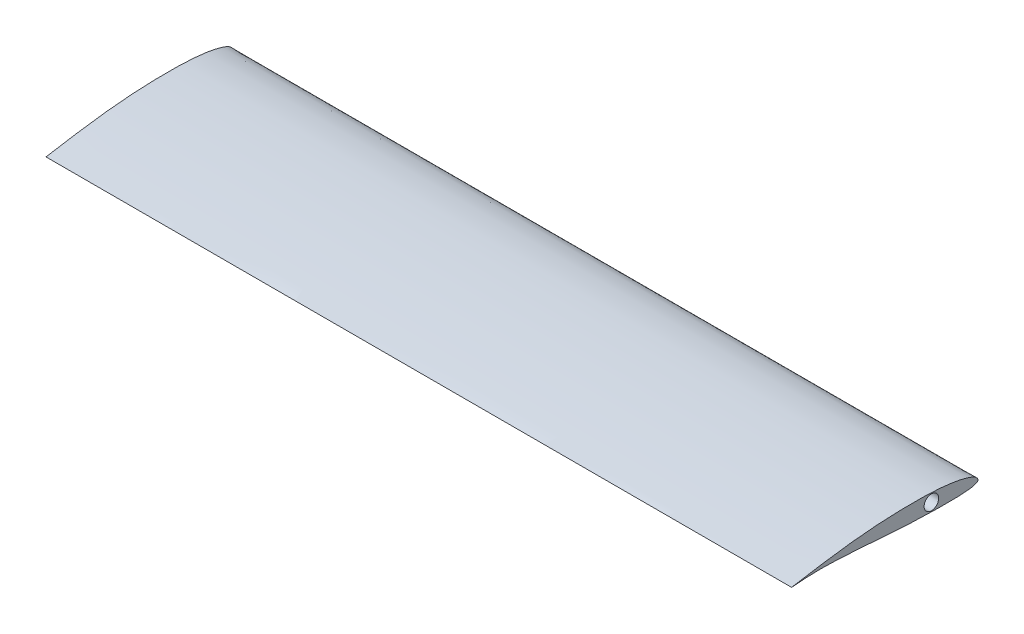
ISO-10303-21;
HEADER;
FILE_DESCRIPTION(('STEP AP214'),'2;1');
FILE_NAME('part.step','',(''),(''),'','','');
FILE_SCHEMA(('AUTOMOTIVE_DESIGN { 1 0 10303 214 1 1 1 1 }'));
ENDSEC;
DATA;
#1=APPLICATION_CONTEXT('core data for automotive mechanical design processes');
#2=APPLICATION_PROTOCOL_DEFINITION('international standard','automotive_design',2000,#1);
#3=PRODUCT_CONTEXT('',#1,'mechanical');
#4=PRODUCT('Part','Part','',(#3));
#5=PRODUCT_RELATED_PRODUCT_CATEGORY('part','',(#4));
#6=PRODUCT_DEFINITION_FORMATION('','',#4);
#7=PRODUCT_DEFINITION_CONTEXT('part definition',#1,'design');
#8=PRODUCT_DEFINITION('design','',#6,#7);
#9=PRODUCT_DEFINITION_SHAPE('','',#8);
#10=(LENGTH_UNIT() NAMED_UNIT(*) SI_UNIT(.MILLI.,.METRE.));
#11=(NAMED_UNIT(*) PLANE_ANGLE_UNIT() SI_UNIT($,.RADIAN.));
#12=(NAMED_UNIT(*) SI_UNIT($,.STERADIAN.) SOLID_ANGLE_UNIT());
#13=UNCERTAINTY_MEASURE_WITH_UNIT(LENGTH_MEASURE(1.E-05),#10,'distance_accuracy_value','');
#14=(GEOMETRIC_REPRESENTATION_CONTEXT(3) GLOBAL_UNCERTAINTY_ASSIGNED_CONTEXT((#13)) GLOBAL_UNIT_ASSIGNED_CONTEXT((#10,
#11,#12)) REPRESENTATION_CONTEXT('',''));
#15=CARTESIAN_POINT('',(0.,0.,0.));
#16=DIRECTION('',(0.,0.,1.));
#17=DIRECTION('',(1.,0.,0.));
#18=AXIS2_PLACEMENT_3D('',#15,#16,#17);
#19=CARTESIAN_POINT('',(920.,1.37734242151728,0.400284716731996));
#20=DIRECTION('',(-1.,0.,0.));
#21=DIRECTION('',(0.,0.,1.));
#22=AXIS2_PLACEMENT_3D('',#19,#20,#21);
#23=PLANE('',#22);
#24=CARTESIAN_POINT('',(920.,0.,230.));
#25=CARTESIAN_POINT('',(920.,-0.00739937229421117,230.000210030184));
#26=CARTESIAN_POINT('',(920.,0.158585605330025,228.422159074289));
#27=CARTESIAN_POINT('',(920.,0.28399481361177,226.796663425836));
#28=CARTESIAN_POINT('',(920.,0.63083810634416,222.814236355926));
#29=CARTESIAN_POINT('',(920.,0.988173406602738,217.861944362416));
#30=CARTESIAN_POINT('',(920.,1.37753186075403,211.305955075508));
#31=CARTESIAN_POINT('',(920.,1.67736111446265,203.489426002418));
#32=CARTESIAN_POINT('',(920.,1.8102160126262,194.430608751108));
#33=CARTESIAN_POINT('',(920.,1.68656337187299,184.34149344494));
#34=CARTESIAN_POINT('',(920.,1.27843686665431,173.419920532683));
#35=CARTESIAN_POINT('',(920.,0.649532951760826,161.877392424038));
#36=CARTESIAN_POINT('',(920.,-0.147391950236595,149.896910924253));
#37=CARTESIAN_POINT('',(920.,-1.05617502106426,137.646510004128));
#38=CARTESIAN_POINT('',(920.,-2.01565091705212,125.282246595146));
#39=CARTESIAN_POINT('',(920.,-2.96201726083683,112.945769304184));
#40=CARTESIAN_POINT('',(920.,-3.82052367657451,100.758449300459));
#41=CARTESIAN_POINT('',(920.,-4.54347921568493,88.8224082965802));
#42=CARTESIAN_POINT('',(920.,-5.09388424647181,77.2255537575113));
#43=CARTESIAN_POINT('',(920.,-5.4718363482422,66.0576921473994));
#44=CARTESIAN_POINT('',(920.,-5.72097486368047,55.4256355228258));
#45=CARTESIAN_POINT('',(920.,-5.84694017537255,45.4468342594944));
#46=CARTESIAN_POINT('',(920.,-5.87087692579245,36.2454480987242));
#47=CARTESIAN_POINT('',(920.,-5.76384529189728,27.9329800546095));
#48=CARTESIAN_POINT('',(920.,-5.53119172353439,20.6192066149059));
#49=CARTESIAN_POINT('',(920.,-5.14963918866787,14.3761290521995));
#50=CARTESIAN_POINT('',(920.,-4.53441005300758,9.26615491003243));
#51=CARTESIAN_POINT('',(920.,-3.71721122294693,5.24187720317273));
#52=CARTESIAN_POINT('',(920.,-2.63649274565435,2.41529498764514));
#53=CARTESIAN_POINT('',(920.,-1.57460619235819,0.455293487041985));
#54=CARTESIAN_POINT('',(920.,-0.377617892176388,-0.0196075451747678));
#55=CARTESIAN_POINT('',(920.,0.729247040567741,0.0286756636182197));
#56=CARTESIAN_POINT('',(920.,2.12122958997737,0.747591302541487));
#57=CARTESIAN_POINT('',(920.,3.89928423051589,2.5105544353957));
#58=CARTESIAN_POINT('',(920.,5.62871835138388,5.30831466195454));
#59=CARTESIAN_POINT('',(920.,7.28050666556761,9.09046737986192));
#60=CARTESIAN_POINT('',(920.,8.87001272411224,13.8689360302926));
#61=CARTESIAN_POINT('',(920.,10.3811847687813,19.5948520438879));
#62=CARTESIAN_POINT('',(920.,11.7653112178947,26.2173983506437));
#63=CARTESIAN_POINT('',(920.,12.9700081154773,33.6787835337481));
#64=CARTESIAN_POINT('',(920.,13.9466746957906,41.9271861650788));
#65=CARTESIAN_POINT('',(920.,14.6840316781373,50.9062772685125));
#66=CARTESIAN_POINT('',(920.,15.1745441593171,60.5512135785162));
#67=CARTESIAN_POINT('',(920.,15.4486305287309,70.7768661596188));
#68=CARTESIAN_POINT('',(920.,15.5155738004362,81.481593105865));
#69=CARTESIAN_POINT('',(920.,15.3885780681208,92.549239894699));
#70=CARTESIAN_POINT('',(920.,15.0727142586277,103.85771990383));
#71=CARTESIAN_POINT('',(920.,14.5595277732969,115.286686553618));
#72=CARTESIAN_POINT('',(920.,13.8481453204629,126.72428780931));
#73=CARTESIAN_POINT('',(920.,12.9345919482879,138.066593631518));
#74=CARTESIAN_POINT('',(920.,11.8510600271469,149.216065051228));
#75=CARTESIAN_POINT('',(920.,10.6253379183885,160.069948376467));
#76=CARTESIAN_POINT('',(920.,9.3069497507106,170.524175290706));
#77=CARTESIAN_POINT('',(920.,7.94178879521628,180.47003516189));
#78=CARTESIAN_POINT('',(920.,6.56099277314232,189.796406090078));
#79=CARTESIAN_POINT('',(920.,5.27272402660649,198.315522540053));
#80=CARTESIAN_POINT('',(920.,3.94983151698944,206.058984479174));
#81=CARTESIAN_POINT('',(920.,2.92726416383096,212.854340269484));
#82=CARTESIAN_POINT('',(920.,1.93102702391498,218.726725631985));
#83=CARTESIAN_POINT('',(920.,1.14619296332748,223.212303816592));
#84=CARTESIAN_POINT('',(920.,0.508635750532315,226.912966985873));
#85=CARTESIAN_POINT('',(920.,0.226519423468825,228.462126565138));
#86=CARTESIAN_POINT('',(920.,0.00733918706488364,229.999791678165));
#87=CARTESIAN_POINT('',(920.,0.,230.));
#88=B_SPLINE_CURVE_WITH_KNOTS('',3,(#24,#25,#26,#27,#28,#29,#30,#31,#32,#33,#34,#35,#36,#37,#38,
#39,#40,#41,#42,#43,#44,#45,#46,#47,#48,#49,#50,#51,#52,#53,#54,#55,#56,#57,#58,#59,#60,#61,#62,
#63,#64,#65,#66,#67,#68,#69,#70,#71,#72,#73,#74,#75,#76,#77,#78,#79,#80,#81,#82,#83,#84,#85,#86,
#87),.UNSPECIFIED.,.T.,.F.,(4,1,1,1,1,1,1,1,1,1,1,1,1,1,1,1,1,1,1,1,1,1,1,1,1,1,1,1,1,1,1,1,1,1,
1,1,1,1,1,1,1,1,1,1,1,1,1,1,1,1,1,1,1,1,1,1,1,1,1,1,1,4),(0.,0.00158888881614505,
0.0063292178355564,0.0142024564897436,0.0251728077530559,0.0391734833267743,0.0560606311759249,
0.0755789238487883,0.0973636066296903,0.120926258366677,0.145825281006277,0.171670911815127,
0.198108536705041,0.22479018357162,0.25139057978404,0.277643490654311,0.303326750051388,
0.328257458029316,0.352272548115194,0.375156061746876,0.396620664402003,0.416422729294005,
0.434304420097656,0.450054679859308,0.463465465082325,0.474478994238096,0.483169222153172,
0.489678354497499,0.494104066315722,0.496910015324886,0.497289784891853,0.501214273282496,
0.506457950332762,0.51335695674223,0.522168631834455,0.532965969924531,0.545689209241574,
0.56022077890382,0.57643892310517,0.594258689005965,0.613600244568652,0.634342385932902,
0.656331109263004,0.679351893859712,0.703152302846811,0.727478208080039,0.7520707394079,
0.776691163534608,0.801140183976245,0.825214386971546,0.848697423570622,0.871352857669295,
0.892947448931157,0.913230871058069,0.931955467148994,0.94834206907442,0.963693004275676,
0.976235918239566,0.986320058750392,0.993788799349345,0.998424034933867,1.),.UNSPECIFIED.);
#89=CARTESIAN_POINT('',(920.,0.,230.));
#90=VERTEX_POINT('',#89);
#91=EDGE_CURVE('E10',#90,#90,#88,.T.);
#92=ORIENTED_EDGE('',*,*,#91,.T.);
#93=EDGE_LOOP('',(#92));
#94=FACE_BOUND('',#93,.T.);
#95=CARTESIAN_POINT('',(920.,4.67113935089615,57.5));
#96=DIRECTION('',(1.,0.,0.));
#97=DIRECTION('',(0.,0.,-1.));
#98=AXIS2_PLACEMENT_3D('',#95,#96,#97);
#99=CIRCLE('',#98,9.);
#100=CARTESIAN_POINT('',(920.,4.67113935089615,48.5));
#101=VERTEX_POINT('',#100);
#102=EDGE_CURVE('E44',#101,#101,#99,.T.);
#103=ORIENTED_EDGE('',*,*,#102,.F.);
#104=EDGE_LOOP('',(#103));
#105=FACE_BOUND('',#104,.T.);
#106=ADVANCED_FACE('F31',(#94,#105),#23,.F.);
#107=CARTESIAN_POINT('',(0.,1.37734242151728,0.400284716731996));
#108=DIRECTION('',(-1.,0.,0.));
#109=DIRECTION('',(0.,0.,1.));
#110=AXIS2_PLACEMENT_3D('',#107,#108,#109);
#111=PLANE('',#110);
#112=CARTESIAN_POINT('',(0.,0.,230.));
#113=CARTESIAN_POINT('',(0.,-0.00739937229421117,230.000210030184));
#114=CARTESIAN_POINT('',(0.,0.158585605330025,228.422159074289));
#115=CARTESIAN_POINT('',(0.,0.28399481361177,226.796663425836));
#116=CARTESIAN_POINT('',(0.,0.63083810634416,222.814236355926));
#117=CARTESIAN_POINT('',(0.,0.988173406602738,217.861944362416));
#118=CARTESIAN_POINT('',(0.,1.37753186075403,211.305955075508));
#119=CARTESIAN_POINT('',(0.,1.67736111446265,203.489426002418));
#120=CARTESIAN_POINT('',(0.,1.8102160126262,194.430608751108));
#121=CARTESIAN_POINT('',(0.,1.68656337187299,184.34149344494));
#122=CARTESIAN_POINT('',(0.,1.27843686665431,173.419920532683));
#123=CARTESIAN_POINT('',(0.,0.649532951760826,161.877392424038));
#124=CARTESIAN_POINT('',(0.,-0.147391950236595,149.896910924253));
#125=CARTESIAN_POINT('',(0.,-1.05617502106426,137.646510004128));
#126=CARTESIAN_POINT('',(0.,-2.01565091705212,125.282246595146));
#127=CARTESIAN_POINT('',(0.,-2.96201726083683,112.945769304184));
#128=CARTESIAN_POINT('',(0.,-3.82052367657451,100.758449300459));
#129=CARTESIAN_POINT('',(0.,-4.54347921568493,88.8224082965802));
#130=CARTESIAN_POINT('',(0.,-5.09388424647181,77.2255537575113));
#131=CARTESIAN_POINT('',(0.,-5.4718363482422,66.0576921473994));
#132=CARTESIAN_POINT('',(0.,-5.72097486368047,55.4256355228258));
#133=CARTESIAN_POINT('',(0.,-5.84694017537255,45.4468342594944));
#134=CARTESIAN_POINT('',(0.,-5.87087692579245,36.2454480987242));
#135=CARTESIAN_POINT('',(0.,-5.76384529189728,27.9329800546095));
#136=CARTESIAN_POINT('',(0.,-5.53119172353439,20.6192066149059));
#137=CARTESIAN_POINT('',(0.,-5.14963918866787,14.3761290521995));
#138=CARTESIAN_POINT('',(0.,-4.53441005300758,9.26615491003243));
#139=CARTESIAN_POINT('',(0.,-3.71721122294693,5.24187720317273));
#140=CARTESIAN_POINT('',(0.,-2.63649274565435,2.41529498764514));
#141=CARTESIAN_POINT('',(0.,-1.57460619235819,0.455293487041985));
#142=CARTESIAN_POINT('',(0.,-0.377617892176388,-0.0196075451747678));
#143=CARTESIAN_POINT('',(0.,0.729247040567741,0.0286756636182197));
#144=CARTESIAN_POINT('',(0.,2.12122958997737,0.747591302541487));
#145=CARTESIAN_POINT('',(0.,3.89928423051589,2.5105544353957));
#146=CARTESIAN_POINT('',(0.,5.62871835138388,5.30831466195454));
#147=CARTESIAN_POINT('',(0.,7.28050666556761,9.09046737986192));
#148=CARTESIAN_POINT('',(0.,8.87001272411224,13.8689360302926));
#149=CARTESIAN_POINT('',(0.,10.3811847687813,19.5948520438879));
#150=CARTESIAN_POINT('',(0.,11.7653112178947,26.2173983506437));
#151=CARTESIAN_POINT('',(0.,12.9700081154773,33.6787835337481));
#152=CARTESIAN_POINT('',(0.,13.9466746957906,41.9271861650788));
#153=CARTESIAN_POINT('',(0.,14.6840316781373,50.9062772685125));
#154=CARTESIAN_POINT('',(0.,15.1745441593171,60.5512135785162));
#155=CARTESIAN_POINT('',(0.,15.4486305287309,70.7768661596188));
#156=CARTESIAN_POINT('',(0.,15.5155738004362,81.481593105865));
#157=CARTESIAN_POINT('',(0.,15.3885780681208,92.549239894699));
#158=CARTESIAN_POINT('',(0.,15.0727142586277,103.85771990383));
#159=CARTESIAN_POINT('',(0.,14.5595277732969,115.286686553618));
#160=CARTESIAN_POINT('',(0.,13.8481453204629,126.72428780931));
#161=CARTESIAN_POINT('',(0.,12.9345919482879,138.066593631518));
#162=CARTESIAN_POINT('',(0.,11.8510600271469,149.216065051228));
#163=CARTESIAN_POINT('',(0.,10.6253379183885,160.069948376467));
#164=CARTESIAN_POINT('',(0.,9.3069497507106,170.524175290706));
#165=CARTESIAN_POINT('',(0.,7.94178879521628,180.47003516189));
#166=CARTESIAN_POINT('',(0.,6.56099277314232,189.796406090078));
#167=CARTESIAN_POINT('',(0.,5.27272402660649,198.315522540053));
#168=CARTESIAN_POINT('',(0.,3.94983151698944,206.058984479174));
#169=CARTESIAN_POINT('',(0.,2.92726416383096,212.854340269484));
#170=CARTESIAN_POINT('',(0.,1.93102702391498,218.726725631985));
#171=CARTESIAN_POINT('',(0.,1.14619296332748,223.212303816592));
#172=CARTESIAN_POINT('',(0.,0.508635750532315,226.912966985873));
#173=CARTESIAN_POINT('',(0.,0.226519423468825,228.462126565138));
#174=CARTESIAN_POINT('',(0.,0.00733918706488364,229.999791678165));
#175=CARTESIAN_POINT('',(0.,0.,230.));
#176=B_SPLINE_CURVE_WITH_KNOTS('',3,(#112,#113,#114,#115,#116,#117,#118,#119,#120,#121,#122,
#123,#124,#125,#126,#127,#128,#129,#130,#131,#132,#133,#134,#135,#136,#137,#138,#139,#140,#141,
#142,#143,#144,#145,#146,#147,#148,#149,#150,#151,#152,#153,#154,#155,#156,#157,#158,#159,#160,
#161,#162,#163,#164,#165,#166,#167,#168,#169,#170,#171,#172,#173,#174,#175),.UNSPECIFIED.,.T.,
.F.,(4,1,1,1,1,1,1,1,1,1,1,1,1,1,1,1,1,1,1,1,1,1,1,1,1,1,1,1,1,1,1,1,1,1,1,1,1,1,1,1,1,1,1,1,1,
1,1,1,1,1,1,1,1,1,1,1,1,1,1,1,1,4),(0.,0.00158888881614505,0.0063292178355564,
0.0142024564897436,0.0251728077530559,0.0391734833267743,0.0560606311759249,0.0755789238487883,
0.0973636066296903,0.120926258366677,0.145825281006277,0.171670911815127,0.198108536705041,
0.22479018357162,0.25139057978404,0.277643490654311,0.303326750051388,0.328257458029316,
0.352272548115194,0.375156061746876,0.396620664402003,0.416422729294005,0.434304420097656,
0.450054679859308,0.463465465082325,0.474478994238096,0.483169222153172,0.489678354497499,
0.494104066315722,0.496910015324886,0.497289784891853,0.501214273282496,0.506457950332762,
0.51335695674223,0.522168631834455,0.532965969924531,0.545689209241574,0.56022077890382,
0.57643892310517,0.594258689005965,0.613600244568652,0.634342385932902,0.656331109263004,
0.679351893859712,0.703152302846811,0.727478208080039,0.7520707394079,0.776691163534608,
0.801140183976245,0.825214386971546,0.848697423570622,0.871352857669295,0.892947448931157,
0.913230871058069,0.931955467148994,0.94834206907442,0.963693004275676,0.976235918239566,
0.986320058750392,0.993788799349345,0.998424034933867,1.),.UNSPECIFIED.);
#177=CARTESIAN_POINT('',(0.,0.,230.));
#178=VERTEX_POINT('',#177);
#179=EDGE_CURVE('E36',#178,#178,#176,.T.);
#180=ORIENTED_EDGE('',*,*,#179,.F.);
#181=EDGE_LOOP('',(#180));
#182=FACE_BOUND('',#181,.T.);
#183=CARTESIAN_POINT('',(0.,4.67113935089615,57.5));
#184=DIRECTION('',(1.,0.,0.));
#185=DIRECTION('',(0.,0.,-1.));
#186=AXIS2_PLACEMENT_3D('',#183,#184,#185);
#187=CIRCLE('',#186,9.);
#188=CARTESIAN_POINT('',(0.,4.67113935089615,48.5));
#189=VERTEX_POINT('',#188);
#190=EDGE_CURVE('E49',#189,#189,#187,.T.);
#191=ORIENTED_EDGE('',*,*,#190,.T.);
#192=EDGE_LOOP('',(#191));
#193=FACE_BOUND('',#192,.T.);
#194=ADVANCED_FACE('F62',(#182,#193),#111,.T.);
#195=DIRECTION('',(-1.,0.,0.));
#196=VECTOR('',#195,1.);
#197=SURFACE_OF_LINEAR_EXTRUSION('',#88,#196);
#198=ORIENTED_EDGE('',*,*,#91,.F.);
#199=EDGE_LOOP('',(#198));
#200=FACE_BOUND('',#199,.T.);
#201=ORIENTED_EDGE('',*,*,#179,.T.);
#202=EDGE_LOOP('',(#201));
#203=FACE_BOUND('',#202,.T.);
#204=ADVANCED_FACE('F33',(#200,#203),#197,.F.);
#205=CARTESIAN_POINT('',(920.,4.67113935089615,57.5));
#206=DIRECTION('',(-1.,0.,0.));
#207=DIRECTION('',(0.,0.,1.));
#208=AXIS2_PLACEMENT_3D('',#205,#206,#207);
#209=CYLINDRICAL_SURFACE('',#208,9.);
#210=ORIENTED_EDGE('',*,*,#102,.T.);
#211=EDGE_LOOP('',(#210));
#212=FACE_BOUND('',#211,.T.);
#213=ORIENTED_EDGE('',*,*,#190,.F.);
#214=EDGE_LOOP('',(#213));
#215=FACE_BOUND('',#214,.T.);
#216=ADVANCED_FACE('F58',(#212,#215),#209,.F.);
#217=CLOSED_SHELL('',(#106,#194,#204,#216));
#218=MANIFOLD_SOLID_BREP('B2',#217);
#219=ADVANCED_BREP_SHAPE_REPRESENTATION('',(#18,#218),#14);
#220=SHAPE_DEFINITION_REPRESENTATION(#9,#219);
ENDSEC;
END-ISO-10303-21;
